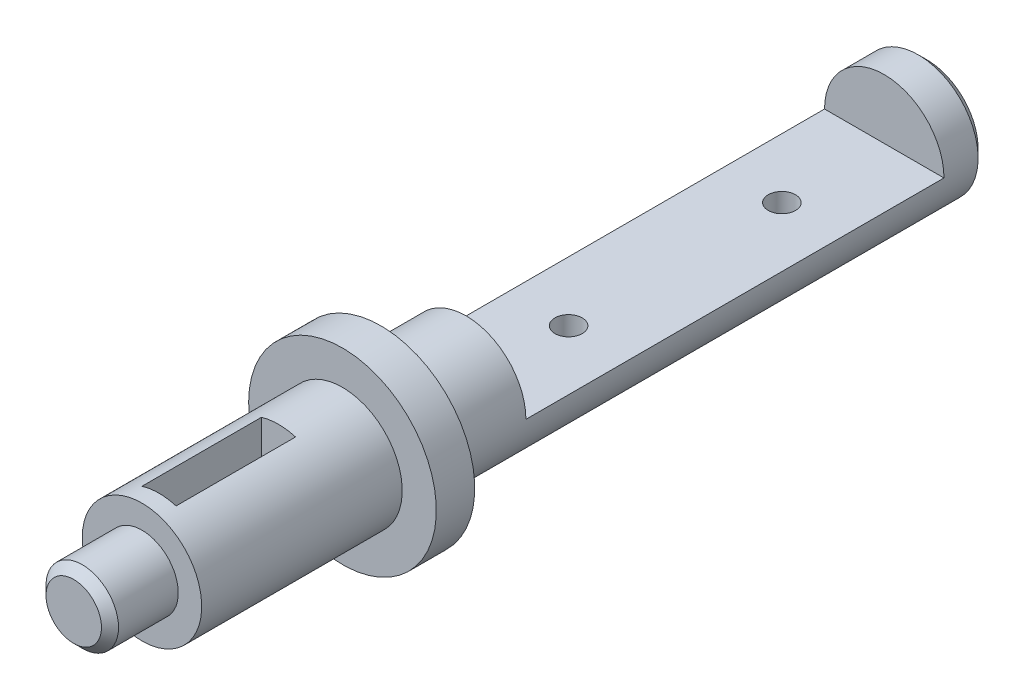
ISO-10303-21;
HEADER;
FILE_DESCRIPTION(('STEP AP214'),'2;1');
FILE_NAME('part.step','',(''),(''),'','','');
FILE_SCHEMA(('AUTOMOTIVE_DESIGN { 1 0 10303 214 1 1 1 1 }'));
ENDSEC;
DATA;
#1=APPLICATION_CONTEXT('core data for automotive mechanical design processes');
#2=APPLICATION_PROTOCOL_DEFINITION('international standard','automotive_design',2000,#1);
#3=PRODUCT_CONTEXT('',#1,'mechanical');
#4=PRODUCT('Part','Part','',(#3));
#5=PRODUCT_RELATED_PRODUCT_CATEGORY('part','',(#4));
#6=PRODUCT_DEFINITION_FORMATION('','',#4);
#7=PRODUCT_DEFINITION_CONTEXT('part definition',#1,'design');
#8=PRODUCT_DEFINITION('design','',#6,#7);
#9=PRODUCT_DEFINITION_SHAPE('','',#8);
#10=(LENGTH_UNIT() NAMED_UNIT(*) SI_UNIT(.MILLI.,.METRE.));
#11=(NAMED_UNIT(*) PLANE_ANGLE_UNIT() SI_UNIT($,.RADIAN.));
#12=(NAMED_UNIT(*) SI_UNIT($,.STERADIAN.) SOLID_ANGLE_UNIT());
#13=UNCERTAINTY_MEASURE_WITH_UNIT(LENGTH_MEASURE(1.E-05),#10,'distance_accuracy_value','');
#14=(GEOMETRIC_REPRESENTATION_CONTEXT(3) GLOBAL_UNCERTAINTY_ASSIGNED_CONTEXT((#13)) GLOBAL_UNIT_ASSIGNED_CONTEXT((#10,
#11,#12)) REPRESENTATION_CONTEXT('',''));
#15=CARTESIAN_POINT('',(0.,0.,0.));
#16=DIRECTION('',(0.,0.,1.));
#17=DIRECTION('',(1.,0.,0.));
#18=AXIS2_PLACEMENT_3D('',#15,#16,#17);
#19=CARTESIAN_POINT('',(0.,0.,-23.5));
#20=DIRECTION('',(0.,0.,1.));
#21=DIRECTION('',(1.,0.,0.));
#22=AXIS2_PLACEMENT_3D('',#19,#20,#21);
#23=CYLINDRICAL_SURFACE('',#22,7.);
#24=CARTESIAN_POINT('',(0.,0.,0.));
#25=DIRECTION('',(0.,0.,-1.));
#26=DIRECTION('',(-1.,0.,0.));
#27=AXIS2_PLACEMENT_3D('',#24,#25,#26);
#28=CIRCLE('',#27,7.);
#29=CARTESIAN_POINT('',(-7.,0.,0.));
#30=VERTEX_POINT('',#29);
#31=EDGE_CURVE('E265',#30,#30,#28,.T.);
#32=ORIENTED_EDGE('',*,*,#31,.T.);
#33=EDGE_LOOP('',(#32));
#34=FACE_BOUND('',#33,.T.);
#35=CARTESIAN_POINT('',(0.,0.,-23.5));
#36=DIRECTION('',(0.,0.,-1.));
#37=DIRECTION('',(-1.,0.,0.));
#38=AXIS2_PLACEMENT_3D('',#35,#36,#37);
#39=CIRCLE('',#38,7.);
#40=CARTESIAN_POINT('',(-7.,0.,-23.5));
#41=VERTEX_POINT('',#40);
#42=EDGE_CURVE('E195',#41,#41,#39,.T.);
#43=ORIENTED_EDGE('',*,*,#42,.F.);
#44=EDGE_LOOP('',(#43));
#45=FACE_BOUND('',#44,.T.);
#46=DIRECTION('',(0.,0.,1.));
#47=VECTOR('',#46,1.);
#48=CARTESIAN_POINT('',(2.,6.70820393249937,-23.5));
#49=LINE('',#48,#47);
#50=CARTESIAN_POINT('',(2.,6.70820393249937,-2.));
#51=VERTEX_POINT('',#50);
#52=CARTESIAN_POINT('',(2.,6.70820393249937,-16.));
#53=VERTEX_POINT('',#52);
#54=EDGE_CURVE('E11',#51,#53,#49,.F.);
#55=ORIENTED_EDGE('',*,*,#54,.F.);
#56=CARTESIAN_POINT('',(0.,0.,-2.));
#57=DIRECTION('',(0.,0.,-1.));
#58=DIRECTION('',(-1.,0.,0.));
#59=AXIS2_PLACEMENT_3D('',#56,#57,#58);
#60=CIRCLE('',#59,7.);
#61=CARTESIAN_POINT('',(-2.,6.70820393249937,-2.));
#62=VERTEX_POINT('',#61);
#63=EDGE_CURVE('E216',#62,#51,#60,.T.);
#64=ORIENTED_EDGE('',*,*,#63,.F.);
#65=DIRECTION('',(0.,0.,1.));
#66=VECTOR('',#65,1.);
#67=CARTESIAN_POINT('',(-2.,6.70820393249937,-23.5));
#68=LINE('',#67,#66);
#69=CARTESIAN_POINT('',(-2.,6.70820393249937,-16.));
#70=VERTEX_POINT('',#69);
#71=EDGE_CURVE('E218',#70,#62,#68,.T.);
#72=ORIENTED_EDGE('',*,*,#71,.F.);
#73=CARTESIAN_POINT('',(0.,0.,-16.));
#74=DIRECTION('',(0.,0.,1.));
#75=DIRECTION('',(1.,0.,0.));
#76=AXIS2_PLACEMENT_3D('',#73,#74,#75);
#77=CIRCLE('',#76,7.);
#78=EDGE_CURVE('E44',#53,#70,#77,.T.);
#79=ORIENTED_EDGE('',*,*,#78,.F.);
#80=EDGE_LOOP('',(#55,#64,#72,#79));
#81=FACE_BOUND('',#80,.T.);
#82=ADVANCED_FACE('F35',(#34,#45,#81),#23,.T.);
#83=CARTESIAN_POINT('',(0.,0.,8.));
#84=DIRECTION('',(0.,0.,-1.));
#85=DIRECTION('',(-1.,0.,0.));
#86=AXIS2_PLACEMENT_3D('',#83,#84,#85);
#87=CYLINDRICAL_SURFACE('',#86,4.25);
#88=CARTESIAN_POINT('',(0.,0.,6.99999999999999));
#89=DIRECTION('',(0.,0.,1.));
#90=DIRECTION('',(1.,0.,0.));
#91=AXIS2_PLACEMENT_3D('',#88,#89,#90);
#92=CIRCLE('',#91,4.25);
#93=CARTESIAN_POINT('',(4.25,0.,6.99999999999999));
#94=VERTEX_POINT('',#93);
#95=EDGE_CURVE('E186',#94,#94,#92,.F.);
#96=ORIENTED_EDGE('',*,*,#95,.T.);
#97=EDGE_LOOP('',(#96));
#98=FACE_BOUND('',#97,.T.);
#99=CARTESIAN_POINT('',(0.,0.,0.));
#100=DIRECTION('',(0.,0.,1.));
#101=DIRECTION('',(1.,0.,0.));
#102=AXIS2_PLACEMENT_3D('',#99,#100,#101);
#103=CIRCLE('',#102,4.25);
#104=CARTESIAN_POINT('',(4.25,0.,0.));
#105=VERTEX_POINT('',#104);
#106=EDGE_CURVE('E190',#105,#105,#103,.T.);
#107=ORIENTED_EDGE('',*,*,#106,.T.);
#108=EDGE_LOOP('',(#107));
#109=FACE_BOUND('',#108,.T.);
#110=ADVANCED_FACE('F155',(#98,#109),#87,.T.);
#111=CARTESIAN_POINT('',(0.,0.,8.));
#112=DIRECTION('',(0.,0.,1.));
#113=DIRECTION('',(1.,0.,0.));
#114=AXIS2_PLACEMENT_3D('',#111,#112,#113);
#115=PLANE('',#114);
#116=CARTESIAN_POINT('',(0.,0.,8.));
#117=DIRECTION('',(0.,0.,1.));
#118=DIRECTION('',(1.,0.,0.));
#119=AXIS2_PLACEMENT_3D('',#116,#117,#118);
#120=CIRCLE('',#119,3.25);
#121=CARTESIAN_POINT('',(3.25,0.,8.));
#122=VERTEX_POINT('',#121);
#123=EDGE_CURVE('E189',#122,#122,#120,.T.);
#124=ORIENTED_EDGE('',*,*,#123,.T.);
#125=EDGE_LOOP('',(#124));
#126=FACE_BOUND('',#125,.T.);
#127=ADVANCED_FACE('F161',(#126),#115,.T.);
#128=CARTESIAN_POINT('',(0.,0.,8.));
#129=DIRECTION('',(0.,0.,-1.));
#130=DIRECTION('',(-1.,0.,0.));
#131=AXIS2_PLACEMENT_3D('',#128,#129,#130);
#132=CONICAL_SURFACE('',#131,3.25,0.785398163397447);
#133=ORIENTED_EDGE('',*,*,#95,.F.);
#134=EDGE_LOOP('',(#133));
#135=FACE_BOUND('',#134,.T.);
#136=ORIENTED_EDGE('',*,*,#123,.F.);
#137=EDGE_LOOP('',(#136));
#138=FACE_BOUND('',#137,.T.);
#139=ADVANCED_FACE('F171',(#135,#138),#132,.T.);
#140=CARTESIAN_POINT('',(0.,0.,0.));
#141=DIRECTION('',(0.,0.,-1.));
#142=DIRECTION('',(-1.,0.,0.));
#143=AXIS2_PLACEMENT_3D('',#140,#141,#142);
#144=PLANE('',#143);
#145=ORIENTED_EDGE('',*,*,#106,.F.);
#146=EDGE_LOOP('',(#145));
#147=FACE_BOUND('',#146,.T.);
#148=ORIENTED_EDGE('',*,*,#31,.F.);
#149=EDGE_LOOP('',(#148));
#150=FACE_BOUND('',#149,.T.);
#151=ADVANCED_FACE('F168',(#147,#150),#144,.F.);
#152=CARTESIAN_POINT('',(0.,0.,-28.));
#153=DIRECTION('',(0.,0.,1.));
#154=DIRECTION('',(1.,0.,0.));
#155=AXIS2_PLACEMENT_3D('',#152,#153,#154);
#156=CYLINDRICAL_SURFACE('',#155,11.);
#157=CARTESIAN_POINT('',(0.,0.,-28.));
#158=DIRECTION('',(0.,0.,-1.));
#159=DIRECTION('',(-1.,0.,0.));
#160=AXIS2_PLACEMENT_3D('',#157,#158,#159);
#161=CIRCLE('',#160,11.);
#162=CARTESIAN_POINT('',(-11.,0.,-28.));
#163=VERTEX_POINT('',#162);
#164=EDGE_CURVE('E259',#163,#163,#161,.T.);
#165=ORIENTED_EDGE('',*,*,#164,.F.);
#166=EDGE_LOOP('',(#165));
#167=FACE_BOUND('',#166,.T.);
#168=CARTESIAN_POINT('',(0.,0.,-23.5));
#169=DIRECTION('',(0.,0.,-1.));
#170=DIRECTION('',(-1.,0.,0.));
#171=AXIS2_PLACEMENT_3D('',#168,#169,#170);
#172=CIRCLE('',#171,11.);
#173=CARTESIAN_POINT('',(-11.,0.,-23.5));
#174=VERTEX_POINT('',#173);
#175=EDGE_CURVE('E262',#174,#174,#172,.T.);
#176=ORIENTED_EDGE('',*,*,#175,.T.);
#177=EDGE_LOOP('',(#176));
#178=FACE_BOUND('',#177,.T.);
#179=ADVANCED_FACE('F181',(#167,#178),#156,.T.);
#180=CARTESIAN_POINT('',(0.,0.,-28.));
#181=DIRECTION('',(0.,0.,-1.));
#182=DIRECTION('',(-1.,0.,0.));
#183=AXIS2_PLACEMENT_3D('',#180,#181,#182);
#184=PLANE('',#183);
#185=CARTESIAN_POINT('',(0.,0.,-28.));
#186=DIRECTION('',(0.,0.,-1.));
#187=DIRECTION('',(-1.,0.,0.));
#188=AXIS2_PLACEMENT_3D('',#185,#186,#187);
#189=CIRCLE('',#188,7.);
#190=CARTESIAN_POINT('',(-7.,0.,-28.));
#191=VERTEX_POINT('',#190);
#192=EDGE_CURVE('E192',#191,#191,#189,.T.);
#193=ORIENTED_EDGE('',*,*,#192,.F.);
#194=EDGE_LOOP('',(#193));
#195=FACE_BOUND('',#194,.T.);
#196=ORIENTED_EDGE('',*,*,#164,.T.);
#197=EDGE_LOOP('',(#196));
#198=FACE_BOUND('',#197,.T.);
#199=ADVANCED_FACE('F246',(#195,#198),#184,.T.);
#200=CARTESIAN_POINT('',(0.,0.,-23.5));
#201=DIRECTION('',(0.,0.,-1.));
#202=DIRECTION('',(-1.,0.,0.));
#203=AXIS2_PLACEMENT_3D('',#200,#201,#202);
#204=PLANE('',#203);
#205=ORIENTED_EDGE('',*,*,#42,.T.);
#206=EDGE_LOOP('',(#205));
#207=FACE_BOUND('',#206,.T.);
#208=ORIENTED_EDGE('',*,*,#175,.F.);
#209=EDGE_LOOP('',(#208));
#210=FACE_BOUND('',#209,.T.);
#211=ADVANCED_FACE('F242',(#207,#210),#204,.F.);
#212=CARTESIAN_POINT('',(0.,0.,-92.));
#213=DIRECTION('',(0.,0.,1.));
#214=DIRECTION('',(1.,0.,0.));
#215=AXIS2_PLACEMENT_3D('',#212,#213,#214);
#216=CYLINDRICAL_SURFACE('',#215,7.);
#217=CARTESIAN_POINT('',(0.,0.,-91.));
#218=DIRECTION('',(0.,0.,-1.));
#219=DIRECTION('',(-1.,0.,0.));
#220=AXIS2_PLACEMENT_3D('',#217,#218,#219);
#221=CIRCLE('',#220,7.);
#222=CARTESIAN_POINT('',(-7.,0.,-91.));
#223=VERTEX_POINT('',#222);
#224=EDGE_CURVE('E213',#223,#223,#221,.F.);
#225=ORIENTED_EDGE('',*,*,#224,.T.);
#226=EDGE_LOOP('',(#225));
#227=FACE_BOUND('',#226,.T.);
#228=CARTESIAN_POINT('',(0.,-7.,-73.4));
#229=CARTESIAN_POINT('',(-0.0886379741131133,-6.9999983872272,-73.400002879363));
#230=CARTESIAN_POINT('',(-0.177309902783651,-6.9982994143405,-73.4073904938864));
#231=CARTESIAN_POINT('',(-0.35212820851627,-6.99168612205081,-73.4367110131099));
#232=CARTESIAN_POINT('',(-0.438272853212982,-6.98676964859253,-73.458653662262));
#233=CARTESIAN_POINT('',(-0.60548544264303,-6.97426787089279,-73.516355654998));
#234=CARTESIAN_POINT('',(-0.686558820616923,-6.96668548260668,-73.5520999066825));
#235=CARTESIAN_POINT('',(-0.841556086538907,-6.94966694289325,-73.6363409474872));
#236=CARTESIAN_POINT('',(-0.915480028205753,-6.94023080539608,-73.684837640779));
#237=CARTESIAN_POINT('',(-1.05537027504478,-6.92035181193555,-73.7941008839362));
#238=CARTESIAN_POINT('',(-1.12119415882717,-6.90989552728095,-73.8550473474598));
#239=CARTESIAN_POINT('',(-1.24177996460575,-6.88924768150588,-73.9870941557469));
#240=CARTESIAN_POINT('',(-1.29654082601189,-6.87905614584792,-74.058195472922));
#241=CARTESIAN_POINT('',(-1.39408692819905,-6.85995847893103,-74.2096026248543));
#242=CARTESIAN_POINT('',(-1.43671823416617,-6.85106950982719,-74.290009993304));
#243=CARTESIAN_POINT('',(-1.50780692535941,-6.83577715386942,-74.457084748642));
#244=CARTESIAN_POINT('',(-1.53626617417339,-6.82937344023545,-74.5437513107459));
#245=CARTESIAN_POINT('',(-1.57772761045187,-6.81991381908383,-74.7193327607386));
#246=CARTESIAN_POINT('',(-1.59098317235359,-6.81680310247685,-74.8081847996238));
#247=CARTESIAN_POINT('',(-1.60244923054372,-6.81411724511115,-74.9869018315707));
#248=CARTESIAN_POINT('',(-1.60066175338078,-6.81454162811538,-75.0767666865603));
#249=CARTESIAN_POINT('',(-1.58229584564286,-6.81882850388362,-75.2530575675456));
#250=CARTESIAN_POINT('',(-1.56601399284799,-6.82262205453538,-75.3395164237202));
#251=CARTESIAN_POINT('',(-1.51959235839624,-6.83311056805478,-75.5084419746334));
#252=CARTESIAN_POINT('',(-1.48945173544397,-6.83980570706166,-75.5909084266776));
#253=CARTESIAN_POINT('',(-1.41590179551203,-6.85540954631912,-75.7503303458723));
#254=CARTESIAN_POINT('',(-1.37238038511703,-6.86433682288867,-75.8272322041738));
#255=CARTESIAN_POINT('',(-1.27338296370284,-6.88338794534674,-75.9727501020592));
#256=CARTESIAN_POINT('',(-1.21790518201741,-6.89351196836579,-76.0413649120303));
#257=CARTESIAN_POINT('',(-1.09501002026373,-6.91411002021802,-76.1700661951379));
#258=CARTESIAN_POINT('',(-1.02734100537028,-6.9245866600269,-76.2299122244695));
#259=CARTESIAN_POINT('',(-0.882806184871845,-6.94449181379643,-76.3374478421384));
#260=CARTESIAN_POINT('',(-0.805940181600778,-6.95392030522139,-76.3851371691292));
#261=CARTESIAN_POINT('',(-0.644884971232097,-6.97070200113656,-76.4670736256181));
#262=CARTESIAN_POINT('',(-0.560678003712239,-6.9780499790254,-76.5012869839869));
#263=CARTESIAN_POINT('',(-0.387504234089219,-6.98980420293078,-76.5550098675797));
#264=CARTESIAN_POINT('',(-0.298538191835773,-6.99421091705401,-76.5745217326327));
#265=CARTESIAN_POINT('',(-0.120432095757168,-6.99951866685356,-76.5979327915628));
#266=CARTESIAN_POINT('',(-0.0313373087821665,-7.00049336935576,-76.6021601164297));
#267=CARTESIAN_POINT('',(0.146285614410677,-6.99903472580627,-76.5957746682709));
#268=CARTESIAN_POINT('',(0.234813792308925,-6.99660163339889,-76.5851629997209));
#269=CARTESIAN_POINT('',(0.4076873130809,-6.98864749841626,-76.5496724719328));
#270=CARTESIAN_POINT('',(0.492070307479888,-6.98316417724177,-76.5249678038549));
#271=CARTESIAN_POINT('',(0.655493499456105,-6.96972431623483,-76.4621875836935));
#272=CARTESIAN_POINT('',(0.734533213316245,-6.96176755285037,-76.4241108229874));
#273=CARTESIAN_POINT('',(0.886367687251043,-6.94408308005348,-76.3349981059696));
#274=CARTESIAN_POINT('',(0.959047877760319,-6.93433004627506,-76.2837720808445));
#275=CARTESIAN_POINT('',(1.09489796862016,-6.91418274262073,-76.1700629708132));
#276=CARTESIAN_POINT('',(1.15806650959624,-6.90378838138707,-76.1075782796523));
#277=CARTESIAN_POINT('',(1.27441433415696,-6.88327217052232,-75.971613894657));
#278=CARTESIAN_POINT('',(1.32736542436475,-6.87316010202361,-75.8979371693417));
#279=CARTESIAN_POINT('',(1.42014568673761,-6.85459217937568,-75.7425452885023));
#280=CARTESIAN_POINT('',(1.45997544034787,-6.84613625184471,-75.6608304893775));
#281=CARTESIAN_POINT('',(1.52510233475196,-6.83192320943003,-75.4921270019111));
#282=CARTESIAN_POINT('',(1.55048352621184,-6.8261505223237,-75.4051721386357));
#283=CARTESIAN_POINT('',(1.58623294768793,-6.81793280308827,-75.228081178366));
#284=CARTESIAN_POINT('',(1.59660383590367,-6.81548718176819,-75.1379456475381));
#285=CARTESIAN_POINT('',(1.60191713966865,-6.81424002220294,-74.9593587908359));
#286=CARTESIAN_POINT('',(1.59722216322636,-6.81535283659213,-74.8709186621501));
#287=CARTESIAN_POINT('',(1.57335344851474,-6.82090215933048,-74.6961260396423));
#288=CARTESIAN_POINT('',(1.55417991450032,-6.8253386207916,-74.6097735163873));
#289=CARTESIAN_POINT('',(1.50208069867066,-6.83699174905262,-74.4419273840594));
#290=CARTESIAN_POINT('',(1.46921240079545,-6.84419680517553,-74.3604151029662));
#291=CARTESIAN_POINT('',(1.39070434633884,-6.86057886631992,-74.2040096813169));
#292=CARTESIAN_POINT('',(1.34506312066393,-6.86975609814535,-74.1291173034614));
#293=CARTESIAN_POINT('',(1.24112205369902,-6.88930081822239,-73.9863005335126));
#294=CARTESIAN_POINT('',(1.18256580162534,-6.89969005119125,-73.9185656961891));
#295=CARTESIAN_POINT('',(1.05497064314006,-6.92034723727384,-73.7937650403897));
#296=CARTESIAN_POINT('',(0.985929302056404,-6.93061516162092,-73.736701706757));
#297=CARTESIAN_POINT('',(0.838120123652075,-6.95004925533688,-73.6340692486316));
#298=CARTESIAN_POINT('',(0.759226112832239,-6.95919735284637,-73.5886782012107));
#299=CARTESIAN_POINT('',(0.594732358167687,-6.97517728336576,-73.5118741830345));
#300=CARTESIAN_POINT('',(0.509138061656781,-6.98201097439818,-73.480449993222));
#301=CARTESIAN_POINT('',(0.352937289255286,-6.99143480981195,-73.4377944444559));
#302=CARTESIAN_POINT('',(0.283148003366609,-6.9946262247138,-73.4236496132666));
#303=CARTESIAN_POINT('',(0.142246387987,-6.99890941185625,-73.4047514821006));
#304=CARTESIAN_POINT('',(0.0711341281292483,-7.00000129428936,-73.3999976892412));
#305=CARTESIAN_POINT('',(0.,-7.,-73.4));
#306=B_SPLINE_CURVE_WITH_KNOTS('',3,(#228,#229,#230,#231,#232,#233,#234,#235,#236,#237,#238,
#239,#240,#241,#242,#243,#244,#245,#246,#247,#248,#249,#250,#251,#252,#253,#254,#255,#256,#257,
#258,#259,#260,#261,#262,#263,#264,#265,#266,#267,#268,#269,#270,#271,#272,#273,#274,#275,#276,
#277,#278,#279,#280,#281,#282,#283,#284,#285,#286,#287,#288,#289,#290,#291,#292,#293,#294,#295,
#296,#297,#298,#299,#300,#301,#302,#303,#304,#305),.UNSPECIFIED.,.T.,.F.,(4,2,2,2,2,2,2,2,2,2,2,
2,2,2,2,2,2,2,2,2,2,2,2,2,2,2,2,2,2,2,2,2,2,2,2,2,2,2,4),(0.,0.265653454780167,
0.531484941673853,0.797026564255704,1.06256619148109,1.33225579298311,1.60197123683722,
1.87497075796354,2.14793437089226,2.41627965691394,2.68458879292178,2.94753095692228,
3.2104890849109,3.47571302204904,3.74097626427095,4.01252133545155,4.28407224385747,
4.55629940094897,4.8284832223289,5.09478785937702,5.36107267625686,5.62413536437478,
5.88722183525807,6.15434929210438,6.42151488978989,6.69409075828751,6.96665454651791,
7.23761612493489,7.50852971244207,7.77297224843265,8.03741105389429,8.30075277457335,
8.56412479627138,8.8332912891387,9.10252037918338,9.37564127946976,9.64854239364145,
9.86174693668259,10.0749402895247),.UNSPECIFIED.);
#307=CARTESIAN_POINT('',(0.,-7.,-73.4));
#308=VERTEX_POINT('',#307);
#309=EDGE_CURVE('E124',#308,#308,#306,.T.);
#310=ORIENTED_EDGE('',*,*,#309,.F.);
#311=EDGE_LOOP('',(#310));
#312=FACE_BOUND('',#311,.T.);
#313=CARTESIAN_POINT('',(0.,-7.,-48.4));
#314=CARTESIAN_POINT('',(-0.088637974113113,-6.9999983872272,-48.400002879363));
#315=CARTESIAN_POINT('',(-0.177309902783651,-6.9982994143405,-48.4073904938864));
#316=CARTESIAN_POINT('',(-0.352128208516269,-6.99168612205081,-48.4367110131099));
#317=CARTESIAN_POINT('',(-0.438272853212979,-6.98676964859253,-48.458653662262));
#318=CARTESIAN_POINT('',(-0.605485442643026,-6.97426787089279,-48.516355654998));
#319=CARTESIAN_POINT('',(-0.686558820616918,-6.96668548260668,-48.5520999066825));
#320=CARTESIAN_POINT('',(-0.841556086538902,-6.94966694289326,-48.6363409474872));
#321=CARTESIAN_POINT('',(-0.91548002820575,-6.94023080539608,-48.684837640779));
#322=CARTESIAN_POINT('',(-1.05537027504478,-6.92035181193555,-48.7941008839362));
#323=CARTESIAN_POINT('',(-1.12119415882717,-6.90989552728095,-48.8550473474598));
#324=CARTESIAN_POINT('',(-1.24177996460575,-6.88924768150588,-48.9870941557469));
#325=CARTESIAN_POINT('',(-1.29654082601189,-6.87905614584792,-49.058195472922));
#326=CARTESIAN_POINT('',(-1.39408692819904,-6.85995847893104,-49.2096026248543));
#327=CARTESIAN_POINT('',(-1.43671823416616,-6.8510695098272,-49.2900099933039));
#328=CARTESIAN_POINT('',(-1.5078069253594,-6.83577715386942,-49.457084748642));
#329=CARTESIAN_POINT('',(-1.53626617417339,-6.82937344023545,-49.5437513107459));
#330=CARTESIAN_POINT('',(-1.57772761045187,-6.81991381908383,-49.7193327607386));
#331=CARTESIAN_POINT('',(-1.59098317235358,-6.81680310247685,-49.8081847996238));
#332=CARTESIAN_POINT('',(-1.60244923054371,-6.81411724511115,-49.9869018315707));
#333=CARTESIAN_POINT('',(-1.60066175338077,-6.81454162811538,-50.0767666865602));
#334=CARTESIAN_POINT('',(-1.58229584564285,-6.81882850388362,-50.2530575675455));
#335=CARTESIAN_POINT('',(-1.56601399284799,-6.82262205453539,-50.3395164237202));
#336=CARTESIAN_POINT('',(-1.51959235839624,-6.83311056805478,-50.5084419746334));
#337=CARTESIAN_POINT('',(-1.48945173544396,-6.83980570706166,-50.5909084266776));
#338=CARTESIAN_POINT('',(-1.41590179551202,-6.85540954631912,-50.7503303458723));
#339=CARTESIAN_POINT('',(-1.37238038511702,-6.86433682288867,-50.8272322041738));
#340=CARTESIAN_POINT('',(-1.27338296370284,-6.88338794534674,-50.9727501020592));
#341=CARTESIAN_POINT('',(-1.2179051820174,-6.89351196836579,-51.0413649120303));
#342=CARTESIAN_POINT('',(-1.09501002026373,-6.91411002021802,-51.1700661951379));
#343=CARTESIAN_POINT('',(-1.02734100537028,-6.9245866600269,-51.2299122244695));
#344=CARTESIAN_POINT('',(-0.882806184871842,-6.94449181379644,-51.3374478421385));
#345=CARTESIAN_POINT('',(-0.805940181600774,-6.95392030522139,-51.3851371691292));
#346=CARTESIAN_POINT('',(-0.644884971232094,-6.97070200113656,-51.4670736256181));
#347=CARTESIAN_POINT('',(-0.560678003712239,-6.9780499790254,-51.5012869839869));
#348=CARTESIAN_POINT('',(-0.387504234089222,-6.98980420293078,-51.5550098675797));
#349=CARTESIAN_POINT('',(-0.298538191835776,-6.99421091705401,-51.5745217326327));
#350=CARTESIAN_POINT('',(-0.12043209575717,-6.99951866685356,-51.5979327915628));
#351=CARTESIAN_POINT('',(-0.0313373087821692,-7.00049336935576,-51.6021601164297));
#352=CARTESIAN_POINT('',(0.146285614410674,-6.99903472580627,-51.5957746682709));
#353=CARTESIAN_POINT('',(0.234813792308921,-6.99660163339889,-51.5851629997209));
#354=CARTESIAN_POINT('',(0.407687313080896,-6.98864749841626,-51.5496724719328));
#355=CARTESIAN_POINT('',(0.492070307479883,-6.98316417724177,-51.524967803855));
#356=CARTESIAN_POINT('',(0.655493499456101,-6.96972431623483,-51.4621875836935));
#357=CARTESIAN_POINT('',(0.734533213316241,-6.96176755285037,-51.4241108229874));
#358=CARTESIAN_POINT('',(0.886367687251038,-6.94408308005348,-51.3349981059696));
#359=CARTESIAN_POINT('',(0.959047877760313,-6.93433004627506,-51.2837720808445));
#360=CARTESIAN_POINT('',(1.09489796862015,-6.91418274262074,-51.1700629708132));
#361=CARTESIAN_POINT('',(1.15806650959624,-6.90378838138707,-51.1075782796523));
#362=CARTESIAN_POINT('',(1.27441433415695,-6.88327217052232,-50.971613894657));
#363=CARTESIAN_POINT('',(1.32736542436474,-6.87316010202361,-50.8979371693417));
#364=CARTESIAN_POINT('',(1.4201456867376,-6.85459217937569,-50.7425452885023));
#365=CARTESIAN_POINT('',(1.45997544034786,-6.84613625184471,-50.6608304893775));
#366=CARTESIAN_POINT('',(1.52510233475195,-6.83192320943003,-50.4921270019111));
#367=CARTESIAN_POINT('',(1.55048352621184,-6.8261505223237,-50.4051721386357));
#368=CARTESIAN_POINT('',(1.58623294768792,-6.81793280308828,-50.228081178366));
#369=CARTESIAN_POINT('',(1.59660383590366,-6.81548718176819,-50.1379456475382));
#370=CARTESIAN_POINT('',(1.60191713966864,-6.81424002220294,-49.9593587908359));
#371=CARTESIAN_POINT('',(1.59722216322636,-6.81535283659213,-49.8709186621501));
#372=CARTESIAN_POINT('',(1.57335344851474,-6.82090215933048,-49.6961260396423));
#373=CARTESIAN_POINT('',(1.55417991450032,-6.8253386207916,-49.6097735163873));
#374=CARTESIAN_POINT('',(1.50208069867066,-6.83699174905262,-49.4419273840594));
#375=CARTESIAN_POINT('',(1.46921240079544,-6.84419680517553,-49.3604151029662));
#376=CARTESIAN_POINT('',(1.39070434633883,-6.86057886631993,-49.2040096813169));
#377=CARTESIAN_POINT('',(1.34506312066392,-6.86975609814535,-49.1291173034614));
#378=CARTESIAN_POINT('',(1.24112205369901,-6.88930081822239,-48.9863005335126));
#379=CARTESIAN_POINT('',(1.18256580162533,-6.89969005119125,-48.9185656961891));
#380=CARTESIAN_POINT('',(1.05497064314005,-6.92034723727384,-48.7937650403897));
#381=CARTESIAN_POINT('',(0.985929302056402,-6.93061516162092,-48.736701706757));
#382=CARTESIAN_POINT('',(0.838120123652078,-6.95004925533688,-48.6340692486316));
#383=CARTESIAN_POINT('',(0.759226112832243,-6.95919735284637,-48.5886782012107));
#384=CARTESIAN_POINT('',(0.594732358167689,-6.97517728336576,-48.5118741830345));
#385=CARTESIAN_POINT('',(0.509138061656782,-6.98201097439818,-48.480449993222));
#386=CARTESIAN_POINT('',(0.352937289255285,-6.99143480981195,-48.4377944444559));
#387=CARTESIAN_POINT('',(0.283148003366607,-6.9946262247138,-48.4236496132666));
#388=CARTESIAN_POINT('',(0.142246387986998,-6.99890941185625,-48.4047514821006));
#389=CARTESIAN_POINT('',(0.0711341281292474,-7.00000129428936,-48.3999976892412));
#390=CARTESIAN_POINT('',(0.,-7.,-48.4));
#391=B_SPLINE_CURVE_WITH_KNOTS('',3,(#313,#314,#315,#316,#317,#318,#319,#320,#321,#322,#323,
#324,#325,#326,#327,#328,#329,#330,#331,#332,#333,#334,#335,#336,#337,#338,#339,#340,#341,#342,
#343,#344,#345,#346,#347,#348,#349,#350,#351,#352,#353,#354,#355,#356,#357,#358,#359,#360,#361,
#362,#363,#364,#365,#366,#367,#368,#369,#370,#371,#372,#373,#374,#375,#376,#377,#378,#379,#380,
#381,#382,#383,#384,#385,#386,#387,#388,#389,#390),.UNSPECIFIED.,.T.,.F.,(4,2,2,2,2,2,2,2,2,2,2,
2,2,2,2,2,2,2,2,2,2,2,2,2,2,2,2,2,2,2,2,2,2,2,2,2,2,2,4),(0.,0.265653454780166,
0.531484941673849,0.797026564255701,1.06256619148108,1.33225579298311,1.60197123683721,
1.87497075796351,2.14793437089225,2.41627965691393,2.68458879292177,2.94753095692227,
3.21048908491088,3.47571302204903,3.74097626427093,4.01252133545154,4.28407224385746,
4.55629940094895,4.82848322232888,5.09478785937701,5.36107267625684,5.62413536437476,
5.88722183525804,6.15434929210436,6.42151488978986,6.69409075828748,6.96665454651787,
7.23761612493486,7.50852971244203,7.77297224843261,8.03741105389426,8.30075277457334,
8.56412479627136,8.83329128913867,9.10252037918335,9.37564127946972,9.64854239364142,
9.86174693668257,10.0749402895247),.UNSPECIFIED.);
#392=CARTESIAN_POINT('',(0.,-7.,-48.4));
#393=VERTEX_POINT('',#392);
#394=EDGE_CURVE('E125',#393,#393,#391,.T.);
#395=ORIENTED_EDGE('',*,*,#394,.F.);
#396=EDGE_LOOP('',(#395));
#397=FACE_BOUND('',#396,.T.);
#398=CARTESIAN_POINT('',(0.,0.,-87.));
#399=DIRECTION('',(0.,0.,-1.));
#400=DIRECTION('',(-1.,0.,0.));
#401=AXIS2_PLACEMENT_3D('',#398,#399,#400);
#402=CIRCLE('',#401,7.);
#403=CARTESIAN_POINT('',(-7.,0.,-87.));
#404=VERTEX_POINT('',#403);
#405=CARTESIAN_POINT('',(7.,0.,-87.));
#406=VERTEX_POINT('',#405);
#407=EDGE_CURVE('E202',#404,#406,#402,.T.);
#408=ORIENTED_EDGE('',*,*,#407,.T.);
#409=DIRECTION('',(0.,0.,1.));
#410=VECTOR('',#409,1.);
#411=CARTESIAN_POINT('',(7.,0.,-92.));
#412=LINE('',#411,#410);
#413=CARTESIAN_POINT('',(7.,0.,-38.));
#414=VERTEX_POINT('',#413);
#415=EDGE_CURVE('E207',#406,#414,#412,.T.);
#416=ORIENTED_EDGE('',*,*,#415,.T.);
#417=CARTESIAN_POINT('',(0.,0.,-38.));
#418=DIRECTION('',(0.,0.,1.));
#419=DIRECTION('',(1.,0.,0.));
#420=AXIS2_PLACEMENT_3D('',#417,#418,#419);
#421=CIRCLE('',#420,7.);
#422=CARTESIAN_POINT('',(-7.,0.,-38.));
#423=VERTEX_POINT('',#422);
#424=EDGE_CURVE('E204',#414,#423,#421,.T.);
#425=ORIENTED_EDGE('',*,*,#424,.T.);
#426=DIRECTION('',(0.,0.,1.));
#427=VECTOR('',#426,1.);
#428=CARTESIAN_POINT('',(-7.,0.,-92.));
#429=LINE('',#428,#427);
#430=EDGE_CURVE('E199',#423,#404,#429,.F.);
#431=ORIENTED_EDGE('',*,*,#430,.T.);
#432=EDGE_LOOP('',(#408,#416,#425,#431));
#433=FACE_BOUND('',#432,.T.);
#434=ORIENTED_EDGE('',*,*,#192,.T.);
#435=EDGE_LOOP('',(#434));
#436=FACE_BOUND('',#435,.T.);
#437=ADVANCED_FACE('F224',(#227,#312,#397,#433,#436),#216,.T.);
#438=CARTESIAN_POINT('',(0.,0.,-92.));
#439=DIRECTION('',(0.,0.,-1.));
#440=DIRECTION('',(-1.,0.,0.));
#441=AXIS2_PLACEMENT_3D('',#438,#439,#440);
#442=PLANE('',#441);
#443=CARTESIAN_POINT('',(0.,0.,-92.));
#444=DIRECTION('',(0.,0.,-1.));
#445=DIRECTION('',(-1.,0.,0.));
#446=AXIS2_PLACEMENT_3D('',#443,#444,#445);
#447=CIRCLE('',#446,6.00000000000001);
#448=CARTESIAN_POINT('',(-6.00000000000001,0.,-92.));
#449=VERTEX_POINT('',#448);
#450=EDGE_CURVE('E210',#449,#449,#447,.T.);
#451=ORIENTED_EDGE('',*,*,#450,.T.);
#452=EDGE_LOOP('',(#451));
#453=FACE_BOUND('',#452,.T.);
#454=ADVANCED_FACE('F231',(#453),#442,.T.);
#455=CARTESIAN_POINT('',(-11.,0.,-38.));
#456=DIRECTION('',(0.,0.,1.));
#457=DIRECTION('',(1.,0.,0.));
#458=AXIS2_PLACEMENT_3D('',#455,#456,#457);
#459=PLANE('',#458);
#460=DIRECTION('',(1.,0.,0.));
#461=VECTOR('',#460,1.);
#462=CARTESIAN_POINT('',(-11.,0.,-38.));
#463=LINE('',#462,#461);
#464=EDGE_CURVE('E133',#423,#414,#463,.T.);
#465=ORIENTED_EDGE('',*,*,#464,.F.);
#466=ORIENTED_EDGE('',*,*,#424,.F.);
#467=EDGE_LOOP('',(#465,#466));
#468=FACE_BOUND('',#467,.T.);
#469=ADVANCED_FACE('F233',(#468),#459,.F.);
#470=CARTESIAN_POINT('',(-11.,0.,-87.));
#471=DIRECTION('',(0.,0.,-1.));
#472=DIRECTION('',(-1.,0.,0.));
#473=AXIS2_PLACEMENT_3D('',#470,#471,#472);
#474=PLANE('',#473);
#475=DIRECTION('',(1.,0.,0.));
#476=VECTOR('',#475,1.);
#477=CARTESIAN_POINT('',(-11.,0.,-87.));
#478=LINE('',#477,#476);
#479=EDGE_CURVE('E59',#404,#406,#478,.T.);
#480=ORIENTED_EDGE('',*,*,#479,.T.);
#481=ORIENTED_EDGE('',*,*,#407,.F.);
#482=EDGE_LOOP('',(#480,#481));
#483=FACE_BOUND('',#482,.T.);
#484=ADVANCED_FACE('F239',(#483),#474,.F.);
#485=CARTESIAN_POINT('',(-11.,0.,-87.));
#486=DIRECTION('',(0.,-1.,0.));
#487=DIRECTION('',(0.,0.,-1.));
#488=AXIS2_PLACEMENT_3D('',#485,#486,#487);
#489=PLANE('',#488);
#490=CARTESIAN_POINT('',(0.,0.,-75.));
#491=DIRECTION('',(0.,1.,0.));
#492=DIRECTION('',(0.,0.,1.));
#493=AXIS2_PLACEMENT_3D('',#490,#491,#492);
#494=CIRCLE('',#493,1.6);
#495=CARTESIAN_POINT('',(0.,0.,-73.4));
#496=VERTEX_POINT('',#495);
#497=EDGE_CURVE('E121',#496,#496,#494,.T.);
#498=ORIENTED_EDGE('',*,*,#497,.F.);
#499=EDGE_LOOP('',(#498));
#500=FACE_BOUND('',#499,.T.);
#501=CARTESIAN_POINT('',(0.,0.,-50.));
#502=DIRECTION('',(0.,1.,0.));
#503=DIRECTION('',(0.,0.,1.));
#504=AXIS2_PLACEMENT_3D('',#501,#502,#503);
#505=CIRCLE('',#504,1.6);
#506=CARTESIAN_POINT('',(0.,0.,-48.4));
#507=VERTEX_POINT('',#506);
#508=EDGE_CURVE('E98',#507,#507,#505,.T.);
#509=ORIENTED_EDGE('',*,*,#508,.F.);
#510=EDGE_LOOP('',(#509));
#511=FACE_BOUND('',#510,.T.);
#512=ORIENTED_EDGE('',*,*,#479,.F.);
#513=ORIENTED_EDGE('',*,*,#430,.F.);
#514=ORIENTED_EDGE('',*,*,#464,.T.);
#515=ORIENTED_EDGE('',*,*,#415,.F.);
#516=EDGE_LOOP('',(#512,#513,#514,#515));
#517=FACE_BOUND('',#516,.T.);
#518=ADVANCED_FACE('F287',(#500,#511,#517),#489,.F.);
#519=CARTESIAN_POINT('',(0.,-11.001,-50.));
#520=DIRECTION('',(0.,1.,0.));
#521=DIRECTION('',(0.,0.,1.));
#522=AXIS2_PLACEMENT_3D('',#519,#520,#521);
#523=CYLINDRICAL_SURFACE('',#522,1.6);
#524=ORIENTED_EDGE('',*,*,#508,.T.);
#525=EDGE_LOOP('',(#524));
#526=FACE_BOUND('',#525,.T.);
#527=ORIENTED_EDGE('',*,*,#394,.T.);
#528=EDGE_LOOP('',(#527));
#529=FACE_BOUND('',#528,.T.);
#530=ADVANCED_FACE('F282',(#526,#529),#523,.F.);
#531=CARTESIAN_POINT('',(0.,-11.001,-75.));
#532=DIRECTION('',(0.,1.,0.));
#533=DIRECTION('',(0.,0.,1.));
#534=AXIS2_PLACEMENT_3D('',#531,#532,#533);
#535=CYLINDRICAL_SURFACE('',#534,1.6);
#536=ORIENTED_EDGE('',*,*,#497,.T.);
#537=EDGE_LOOP('',(#536));
#538=FACE_BOUND('',#537,.T.);
#539=ORIENTED_EDGE('',*,*,#309,.T.);
#540=EDGE_LOOP('',(#539));
#541=FACE_BOUND('',#540,.T.);
#542=ADVANCED_FACE('F135',(#538,#541),#535,.F.);
#543=CARTESIAN_POINT('',(0.,0.,-92.));
#544=DIRECTION('',(0.,0.,1.));
#545=DIRECTION('',(1.,0.,0.));
#546=AXIS2_PLACEMENT_3D('',#543,#544,#545);
#547=CONICAL_SURFACE('',#546,6.00000000000001,0.785398163397445);
#548=ORIENTED_EDGE('',*,*,#224,.F.);
#549=EDGE_LOOP('',(#548));
#550=FACE_BOUND('',#549,.T.);
#551=ORIENTED_EDGE('',*,*,#450,.F.);
#552=EDGE_LOOP('',(#551));
#553=FACE_BOUND('',#552,.T.);
#554=ADVANCED_FACE('F38',(#550,#553),#547,.T.);
#555=CARTESIAN_POINT('',(2.,10.,-2.));
#556=DIRECTION('',(-1.,0.,0.));
#557=DIRECTION('',(0.,0.,1.));
#558=AXIS2_PLACEMENT_3D('',#555,#556,#557);
#559=PLANE('',#558);
#560=ORIENTED_EDGE('',*,*,#54,.T.);
#561=DIRECTION('',(0.,-1.,0.));
#562=VECTOR('',#561,1.);
#563=CARTESIAN_POINT('',(2.,10.,-16.));
#564=LINE('',#563,#562);
#565=CARTESIAN_POINT('',(2.,0.,-16.));
#566=VERTEX_POINT('',#565);
#567=EDGE_CURVE('E89',#53,#566,#564,.T.);
#568=ORIENTED_EDGE('',*,*,#567,.T.);
#569=DIRECTION('',(0.,0.,-1.));
#570=VECTOR('',#569,1.);
#571=CARTESIAN_POINT('',(2.,0.,-2.));
#572=LINE('',#571,#570);
#573=CARTESIAN_POINT('',(2.,0.,-2.));
#574=VERTEX_POINT('',#573);
#575=EDGE_CURVE('E94',#574,#566,#572,.T.);
#576=ORIENTED_EDGE('',*,*,#575,.F.);
#577=DIRECTION('',(0.,-1.,0.));
#578=VECTOR('',#577,1.);
#579=CARTESIAN_POINT('',(2.,10.,-2.));
#580=LINE('',#579,#578);
#581=EDGE_CURVE('E117',#51,#574,#580,.T.);
#582=ORIENTED_EDGE('',*,*,#581,.F.);
#583=EDGE_LOOP('',(#560,#568,#576,#582));
#584=FACE_BOUND('',#583,.T.);
#585=ADVANCED_FACE('F91',(#584),#559,.T.);
#586=CARTESIAN_POINT('',(-2.,10.,-16.));
#587=DIRECTION('',(0.,0.,1.));
#588=DIRECTION('',(1.,0.,0.));
#589=AXIS2_PLACEMENT_3D('',#586,#587,#588);
#590=PLANE('',#589);
#591=ORIENTED_EDGE('',*,*,#78,.T.);
#592=DIRECTION('',(0.,-1.,0.));
#593=VECTOR('',#592,1.);
#594=CARTESIAN_POINT('',(-2.,10.,-16.));
#595=LINE('',#594,#593);
#596=CARTESIAN_POINT('',(-2.,0.,-16.));
#597=VERTEX_POINT('',#596);
#598=EDGE_CURVE('E99',#70,#597,#595,.T.);
#599=ORIENTED_EDGE('',*,*,#598,.T.);
#600=DIRECTION('',(-1.,0.,0.));
#601=VECTOR('',#600,1.);
#602=CARTESIAN_POINT('',(-2.,0.,-16.));
#603=LINE('',#602,#601);
#604=EDGE_CURVE('E102',#566,#597,#603,.T.);
#605=ORIENTED_EDGE('',*,*,#604,.F.);
#606=ORIENTED_EDGE('',*,*,#567,.F.);
#607=EDGE_LOOP('',(#591,#599,#605,#606));
#608=FACE_BOUND('',#607,.T.);
#609=ADVANCED_FACE('F103',(#608),#590,.T.);
#610=CARTESIAN_POINT('',(-2.,10.,-2.));
#611=DIRECTION('',(1.,0.,0.));
#612=DIRECTION('',(0.,0.,-1.));
#613=AXIS2_PLACEMENT_3D('',#610,#611,#612);
#614=PLANE('',#613);
#615=ORIENTED_EDGE('',*,*,#71,.T.);
#616=DIRECTION('',(0.,-1.,0.));
#617=VECTOR('',#616,1.);
#618=CARTESIAN_POINT('',(-2.,10.,-2.));
#619=LINE('',#618,#617);
#620=CARTESIAN_POINT('',(-2.,0.,-2.));
#621=VERTEX_POINT('',#620);
#622=EDGE_CURVE('E51',#62,#621,#619,.T.);
#623=ORIENTED_EDGE('',*,*,#622,.T.);
#624=DIRECTION('',(0.,0.,1.));
#625=VECTOR('',#624,1.);
#626=CARTESIAN_POINT('',(-2.,0.,-2.));
#627=LINE('',#626,#625);
#628=EDGE_CURVE('E108',#597,#621,#627,.T.);
#629=ORIENTED_EDGE('',*,*,#628,.F.);
#630=ORIENTED_EDGE('',*,*,#598,.F.);
#631=EDGE_LOOP('',(#615,#623,#629,#630));
#632=FACE_BOUND('',#631,.T.);
#633=ADVANCED_FACE('F144',(#632),#614,.T.);
#634=CARTESIAN_POINT('',(-2.,10.,-2.));
#635=DIRECTION('',(0.,0.,-1.));
#636=DIRECTION('',(-1.,0.,0.));
#637=AXIS2_PLACEMENT_3D('',#634,#635,#636);
#638=PLANE('',#637);
#639=ORIENTED_EDGE('',*,*,#63,.T.);
#640=ORIENTED_EDGE('',*,*,#581,.T.);
#641=DIRECTION('',(1.,0.,0.));
#642=VECTOR('',#641,1.);
#643=CARTESIAN_POINT('',(-2.,0.,-2.));
#644=LINE('',#643,#642);
#645=EDGE_CURVE('E112',#621,#574,#644,.T.);
#646=ORIENTED_EDGE('',*,*,#645,.F.);
#647=ORIENTED_EDGE('',*,*,#622,.F.);
#648=EDGE_LOOP('',(#639,#640,#646,#647));
#649=FACE_BOUND('',#648,.T.);
#650=ADVANCED_FACE('F147',(#649),#638,.T.);
#651=CARTESIAN_POINT('',(0.,0.,0.));
#652=DIRECTION('',(0.,-1.,0.));
#653=DIRECTION('',(0.,0.,-1.));
#654=AXIS2_PLACEMENT_3D('',#651,#652,#653);
#655=PLANE('',#654);
#656=ORIENTED_EDGE('',*,*,#575,.T.);
#657=ORIENTED_EDGE('',*,*,#604,.T.);
#658=ORIENTED_EDGE('',*,*,#628,.T.);
#659=ORIENTED_EDGE('',*,*,#645,.T.);
#660=EDGE_LOOP('',(#656,#657,#658,#659));
#661=FACE_BOUND('',#660,.T.);
#662=ADVANCED_FACE('F111',(#661),#655,.F.);
#663=CLOSED_SHELL('',(#82,#110,#127,#139,#151,#179,#199,#211,#437,#454,#469,#484,#518,#530,#542,
#554,#585,#609,#633,#650,#662));
#664=MANIFOLD_SOLID_BREP('B2',#663);
#665=ADVANCED_BREP_SHAPE_REPRESENTATION('',(#18,#664),#14);
#666=SHAPE_DEFINITION_REPRESENTATION(#9,#665);
ENDSEC;
END-ISO-10303-21;
